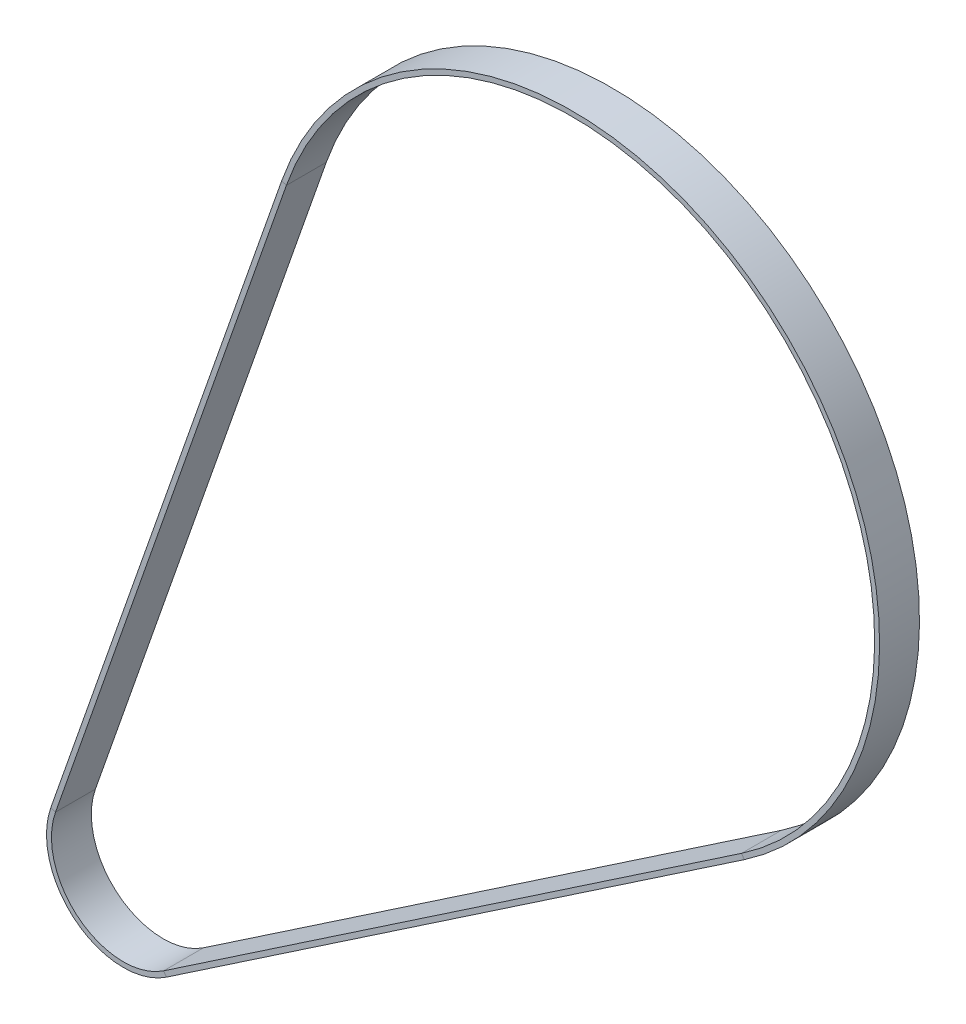
ISO-10303-21;
HEADER;
FILE_DESCRIPTION(('STEP AP214'),'2;1');
FILE_NAME('part.step','',(''),(''),'','','');
FILE_SCHEMA(('AUTOMOTIVE_DESIGN { 1 0 10303 214 1 1 1 1 }'));
ENDSEC;
DATA;
#1=APPLICATION_CONTEXT('core data for automotive mechanical design processes');
#2=APPLICATION_PROTOCOL_DEFINITION('international standard','automotive_design',2000,#1);
#3=PRODUCT_CONTEXT('',#1,'mechanical');
#4=PRODUCT('Part','Part','',(#3));
#5=PRODUCT_RELATED_PRODUCT_CATEGORY('part','',(#4));
#6=PRODUCT_DEFINITION_FORMATION('','',#4);
#7=PRODUCT_DEFINITION_CONTEXT('part definition',#1,'design');
#8=PRODUCT_DEFINITION('design','',#6,#7);
#9=PRODUCT_DEFINITION_SHAPE('','',#8);
#10=(LENGTH_UNIT() NAMED_UNIT(*) SI_UNIT(.MILLI.,.METRE.));
#11=(NAMED_UNIT(*) PLANE_ANGLE_UNIT() SI_UNIT($,.RADIAN.));
#12=(NAMED_UNIT(*) SI_UNIT($,.STERADIAN.) SOLID_ANGLE_UNIT());
#13=UNCERTAINTY_MEASURE_WITH_UNIT(LENGTH_MEASURE(1.E-05),#10,'distance_accuracy_value','');
#14=(GEOMETRIC_REPRESENTATION_CONTEXT(3) GLOBAL_UNCERTAINTY_ASSIGNED_CONTEXT((#13)) GLOBAL_UNIT_ASSIGNED_CONTEXT((#10,
#11,#12)) REPRESENTATION_CONTEXT('',''));
#15=CARTESIAN_POINT('',(0.,0.,0.));
#16=DIRECTION('',(0.,0.,1.));
#17=DIRECTION('',(1.,0.,0.));
#18=AXIS2_PLACEMENT_3D('',#15,#16,#17);
#19=CARTESIAN_POINT('',(-40.9251943674121,-65.1355885995621,2.01184288699567));
#20=DIRECTION('',(0.,0.,1.));
#21=DIRECTION('',(1.,0.,0.));
#22=AXIS2_PLACEMENT_3D('',#19,#20,#21);
#23=PLANE('',#22);
#24=DIRECTION('',(-0.560075457132163,0.828441598616462,0.));
#25=VECTOR('',#24,1.);
#26=CARTESIAN_POINT('',(-40.9251943674121,-65.1355885995621,2.01184288699567));
#27=LINE('',#26,#25);
#28=CARTESIAN_POINT('',(-40.9251943674121,-65.1355885995621,2.01184288699567));
#29=VERTEX_POINT('',#28);
#30=CARTESIAN_POINT('',(-41.2052320959782,-64.7213678002538,2.01184288699567));
#31=VERTEX_POINT('',#30);
#32=EDGE_CURVE('E263',#29,#31,#27,.T.);
#33=ORIENTED_EDGE('',*,*,#32,.T.);
#34=CARTESIAN_POINT('',(-45.2684841897135,-58.711165036947,2.01184288699567));
#35=DIRECTION('',(0.,0.,-1.));
#36=DIRECTION('',(-1.,0.,0.));
#37=AXIS2_PLACEMENT_3D('',#34,#35,#36);
#38=CIRCLE('',#37,7.25482975908508);
#39=CARTESIAN_POINT('',(-52.1144215100444,-56.3099784470695,2.01184288699567));
#40=VERTEX_POINT('',#39);
#41=EDGE_CURVE('E46',#31,#40,#38,.T.);
#42=ORIENTED_EDGE('',*,*,#41,.T.);
#43=CARTESIAN_POINT('',(-52.5862408047534,-56.1444896162068,2.01184288699567));
#44=DIRECTION('',(0.943638589418012,-0.330977661725356,0.));
#45=VECTOR('',#44,1.);
#46=LINE('',#43,#45);
#47=CARTESIAN_POINT('',(-52.5862408047533,-56.1444896162064,2.01184288699567));
#48=VERTEX_POINT('',#47);
#49=EDGE_CURVE('E215',#48,#40,#46,.T.);
#50=ORIENTED_EDGE('',*,*,#49,.F.);
#51=CARTESIAN_POINT('',(-45.2684841897135,-58.711165036947,2.01184288699567));
#52=DIRECTION('',(0.,0.,-1.));
#53=DIRECTION('',(-1.,0.,0.));
#54=AXIS2_PLACEMENT_3D('',#51,#52,#53);
#55=CIRCLE('',#54,7.75482975908509);
#56=EDGE_CURVE('E11',#29,#48,#55,.T.);
#57=ORIENTED_EDGE('',*,*,#56,.F.);
#58=EDGE_LOOP('',(#33,#42,#50,#57));
#59=FACE_BOUND('',#58,.T.);
#60=ADVANCED_FACE('F35',(#59),#23,.T.);
#61=CARTESIAN_POINT('',(-45.2684841897135,-58.711165036947,0.));
#62=DIRECTION('',(0.,0.,-1.));
#63=DIRECTION('',(-1.,0.,0.));
#64=AXIS2_PLACEMENT_3D('',#61,#62,#63);
#65=CYLINDRICAL_SURFACE('',#64,7.25482975908508);
#66=DIRECTION('',(0.,0.,-1.));
#67=VECTOR('',#66,1.);
#68=CARTESIAN_POINT('',(-41.2052320959782,-64.7213678002538,-2.01184288699567));
#69=LINE('',#68,#67);
#70=CARTESIAN_POINT('',(-41.2052320959782,-64.7213678002538,-2.01184288699567));
#71=VERTEX_POINT('',#70);
#72=EDGE_CURVE('E258',#31,#71,#69,.T.);
#73=ORIENTED_EDGE('',*,*,#72,.T.);
#74=CARTESIAN_POINT('',(-45.2684841897135,-58.711165036947,-2.01184288699567));
#75=DIRECTION('',(0.,0.,-1.));
#76=DIRECTION('',(-1.,0.,0.));
#77=AXIS2_PLACEMENT_3D('',#74,#75,#76);
#78=CIRCLE('',#77,7.25482975908508);
#79=CARTESIAN_POINT('',(-52.1144215100444,-56.3099784470695,-2.01184288699567));
#80=VERTEX_POINT('',#79);
#81=EDGE_CURVE('E214',#71,#80,#78,.T.);
#82=ORIENTED_EDGE('',*,*,#81,.T.);
#83=CARTESIAN_POINT('',(-52.1144215100444,-56.3099784470695,2.01184288699567));
#84=DIRECTION('',(0.,0.,-1.));
#85=VECTOR('',#84,1.);
#86=LINE('',#83,#85);
#87=EDGE_CURVE('E238',#40,#80,#86,.T.);
#88=ORIENTED_EDGE('',*,*,#87,.F.);
#89=ORIENTED_EDGE('',*,*,#41,.F.);
#90=EDGE_LOOP('',(#73,#82,#88,#89));
#91=FACE_BOUND('',#90,.T.);
#92=ADVANCED_FACE('F243',(#91),#65,.F.);
#93=CARTESIAN_POINT('',(-40.9251943674121,-65.1355885995621,-2.01184288699567));
#94=DIRECTION('',(0.,0.,-1.));
#95=DIRECTION('',(-1.,0.,0.));
#96=AXIS2_PLACEMENT_3D('',#93,#94,#95);
#97=PLANE('',#96);
#98=DIRECTION('',(0.560075457132163,-0.828441598616462,0.));
#99=VECTOR('',#98,1.);
#100=CARTESIAN_POINT('',(-40.9251943674121,-65.1355885995621,-2.01184288699567));
#101=LINE('',#100,#99);
#102=CARTESIAN_POINT('',(-40.9251943674121,-65.1355885995621,-2.01184288699567));
#103=VERTEX_POINT('',#102);
#104=EDGE_CURVE('E264',#71,#103,#101,.T.);
#105=ORIENTED_EDGE('',*,*,#104,.T.);
#106=CARTESIAN_POINT('',(-45.2684841897135,-58.711165036947,-2.01184288699567));
#107=DIRECTION('',(0.,0.,-1.));
#108=DIRECTION('',(-1.,0.,0.));
#109=AXIS2_PLACEMENT_3D('',#106,#107,#108);
#110=CIRCLE('',#109,7.75482975908509);
#111=CARTESIAN_POINT('',(-52.5862408047533,-56.1444896162064,-2.01184288699567));
#112=VERTEX_POINT('',#111);
#113=EDGE_CURVE('E207',#103,#112,#110,.T.);
#114=ORIENTED_EDGE('',*,*,#113,.T.);
#115=CARTESIAN_POINT('',(-52.1144215100444,-56.3099784470695,-2.01184288699567));
#116=DIRECTION('',(-0.943638589418012,0.330977661725356,0.));
#117=VECTOR('',#116,1.);
#118=LINE('',#115,#117);
#119=EDGE_CURVE('E284',#80,#112,#118,.T.);
#120=ORIENTED_EDGE('',*,*,#119,.F.);
#121=ORIENTED_EDGE('',*,*,#81,.F.);
#122=EDGE_LOOP('',(#105,#114,#120,#121));
#123=FACE_BOUND('',#122,.T.);
#124=ADVANCED_FACE('F200',(#123),#97,.T.);
#125=CARTESIAN_POINT('',(-45.2684841897135,-58.711165036947,0.));
#126=DIRECTION('',(0.,0.,-1.));
#127=DIRECTION('',(-1.,0.,0.));
#128=AXIS2_PLACEMENT_3D('',#125,#126,#127);
#129=CYLINDRICAL_SURFACE('',#128,7.75482975908509);
#130=DIRECTION('',(0.,0.,1.));
#131=VECTOR('',#130,1.);
#132=CARTESIAN_POINT('',(-40.9251943674121,-65.1355885995621,-2.01184288699567));
#133=LINE('',#132,#131);
#134=EDGE_CURVE('E117',#103,#29,#133,.T.);
#135=ORIENTED_EDGE('',*,*,#134,.T.);
#136=ORIENTED_EDGE('',*,*,#56,.T.);
#137=CARTESIAN_POINT('',(-52.5862408047534,-56.1444896162068,-2.01184288699567));
#138=DIRECTION('',(0.,0.,1.));
#139=VECTOR('',#138,1.);
#140=LINE('',#137,#139);
#141=EDGE_CURVE('E54',#112,#48,#140,.T.);
#142=ORIENTED_EDGE('',*,*,#141,.F.);
#143=ORIENTED_EDGE('',*,*,#113,.F.);
#144=EDGE_LOOP('',(#135,#136,#142,#143));
#145=FACE_BOUND('',#144,.T.);
#146=ADVANCED_FACE('F196',(#145),#129,.T.);
#147=CARTESIAN_POINT('',(17.384649330772,-25.714689867404,2.01184288699567));
#148=DIRECTION('',(0.,0.,1.));
#149=DIRECTION('',(1.,0.,0.));
#150=AXIS2_PLACEMENT_3D('',#147,#148,#149);
#151=PLANE('',#150);
#152=DIRECTION('',(-0.560075457132163,0.828441598616462,0.));
#153=VECTOR('',#152,1.);
#154=CARTESIAN_POINT('',(17.384649330772,-25.714689867404,2.01184288699567));
#155=LINE('',#154,#153);
#156=CARTESIAN_POINT('',(17.384649330772,-25.714689867404,2.01184288699567));
#157=VERTEX_POINT('',#156);
#158=CARTESIAN_POINT('',(17.1046116022059,-25.3004690680957,2.01184288699567));
#159=VERTEX_POINT('',#158);
#160=EDGE_CURVE('E114',#157,#159,#155,.T.);
#161=ORIENTED_EDGE('',*,*,#160,.T.);
#162=DIRECTION('',(-0.828441598616452,-0.560075457132178,0.));
#163=VECTOR('',#162,1.);
#164=CARTESIAN_POINT('',(17.1046116022059,-25.3004690680957,2.01184288699567));
#165=LINE('',#164,#163);
#166=EDGE_CURVE('E277',#159,#31,#165,.T.);
#167=ORIENTED_EDGE('',*,*,#166,.T.);
#168=ORIENTED_EDGE('',*,*,#32,.F.);
#169=DIRECTION('',(-0.828441598616452,-0.560075457132178,0.));
#170=VECTOR('',#169,1.);
#171=CARTESIAN_POINT('',(17.384649330772,-25.714689867404,2.01184288699567));
#172=LINE('',#171,#170);
#173=EDGE_CURVE('E279',#157,#29,#172,.T.);
#174=ORIENTED_EDGE('',*,*,#173,.F.);
#175=EDGE_LOOP('',(#161,#167,#168,#174));
#176=FACE_BOUND('',#175,.T.);
#177=ADVANCED_FACE('F192',(#176),#151,.T.);
#178=CARTESIAN_POINT('',(17.1046116022059,-25.3004690680957,-2.01184288699567));
#179=DIRECTION('',(-0.560075457132178,0.828441598616452,0.));
#180=DIRECTION('',(-0.828441598616452,-0.560075457132178,0.));
#181=AXIS2_PLACEMENT_3D('',#178,#179,#180);
#182=PLANE('',#181);
#183=DIRECTION('',(0.,0.,-1.));
#184=VECTOR('',#183,1.);
#185=CARTESIAN_POINT('',(17.1046116022059,-25.3004690680957,-2.01184288699567));
#186=LINE('',#185,#184);
#187=CARTESIAN_POINT('',(17.1046116022059,-25.3004690680957,-2.01184288699567));
#188=VERTEX_POINT('',#187);
#189=EDGE_CURVE('E275',#159,#188,#186,.T.);
#190=ORIENTED_EDGE('',*,*,#189,.T.);
#191=DIRECTION('',(-0.828441598616452,-0.560075457132178,0.));
#192=VECTOR('',#191,1.);
#193=CARTESIAN_POINT('',(17.1046116022059,-25.3004690680957,-2.01184288699567));
#194=LINE('',#193,#192);
#195=EDGE_CURVE('E269',#188,#71,#194,.T.);
#196=ORIENTED_EDGE('',*,*,#195,.T.);
#197=ORIENTED_EDGE('',*,*,#72,.F.);
#198=ORIENTED_EDGE('',*,*,#166,.F.);
#199=EDGE_LOOP('',(#190,#196,#197,#198));
#200=FACE_BOUND('',#199,.T.);
#201=ADVANCED_FACE('F188',(#200),#182,.T.);
#202=CARTESIAN_POINT('',(17.384649330772,-25.714689867404,-2.01184288699567));
#203=DIRECTION('',(0.,0.,-1.));
#204=DIRECTION('',(-1.,0.,0.));
#205=AXIS2_PLACEMENT_3D('',#202,#203,#204);
#206=PLANE('',#205);
#207=DIRECTION('',(0.560075457132163,-0.828441598616462,0.));
#208=VECTOR('',#207,1.);
#209=CARTESIAN_POINT('',(17.384649330772,-25.714689867404,-2.01184288699567));
#210=LINE('',#209,#208);
#211=CARTESIAN_POINT('',(17.384649330772,-25.714689867404,-2.01184288699567));
#212=VERTEX_POINT('',#211);
#213=EDGE_CURVE('E140',#188,#212,#210,.T.);
#214=ORIENTED_EDGE('',*,*,#213,.T.);
#215=DIRECTION('',(-0.828441598616452,-0.560075457132178,0.));
#216=VECTOR('',#215,1.);
#217=CARTESIAN_POINT('',(17.384649330772,-25.714689867404,-2.01184288699567));
#218=LINE('',#217,#216);
#219=EDGE_CURVE('E271',#212,#103,#218,.T.);
#220=ORIENTED_EDGE('',*,*,#219,.T.);
#221=ORIENTED_EDGE('',*,*,#104,.F.);
#222=ORIENTED_EDGE('',*,*,#195,.F.);
#223=EDGE_LOOP('',(#214,#220,#221,#222));
#224=FACE_BOUND('',#223,.T.);
#225=ADVANCED_FACE('F184',(#224),#206,.T.);
#226=CARTESIAN_POINT('',(17.384649330772,-25.714689867404,-2.01184288699567));
#227=DIRECTION('',(0.560075457132178,-0.828441598616452,0.));
#228=DIRECTION('',(0.828441598616452,0.560075457132178,0.));
#229=AXIS2_PLACEMENT_3D('',#226,#227,#228);
#230=PLANE('',#229);
#231=DIRECTION('',(0.,0.,1.));
#232=VECTOR('',#231,1.);
#233=CARTESIAN_POINT('',(17.384649330772,-25.714689867404,-2.01184288699567));
#234=LINE('',#233,#232);
#235=EDGE_CURVE('E137',#212,#157,#234,.T.);
#236=ORIENTED_EDGE('',*,*,#235,.T.);
#237=ORIENTED_EDGE('',*,*,#173,.T.);
#238=ORIENTED_EDGE('',*,*,#134,.F.);
#239=ORIENTED_EDGE('',*,*,#219,.F.);
#240=EDGE_LOOP('',(#236,#237,#238,#239));
#241=FACE_BOUND('',#240,.T.);
#242=ADVANCED_FACE('F181',(#241),#230,.T.);
#243=CARTESIAN_POINT('',(-29.2903853636138,10.2734917459457,2.01184288699567));
#244=DIRECTION('',(0.,0.,1.));
#245=DIRECTION('',(1.,0.,0.));
#246=AXIS2_PLACEMENT_3D('',#243,#244,#245);
#247=PLANE('',#246);
#248=DIRECTION('',(0.943638589418013,-0.330977661725352,0.));
#249=VECTOR('',#248,1.);
#250=CARTESIAN_POINT('',(-29.2903853636138,10.2734917459457,2.01184288699567));
#251=LINE('',#250,#249);
#252=CARTESIAN_POINT('',(-29.2903853636138,10.2734917459457,2.01184288699567));
#253=VERTEX_POINT('',#252);
#254=CARTESIAN_POINT('',(-28.8185660689048,10.1080029150831,2.01184288699567));
#255=VERTEX_POINT('',#254);
#256=EDGE_CURVE('E111',#253,#255,#251,.T.);
#257=ORIENTED_EDGE('',*,*,#256,.T.);
#258=CARTESIAN_POINT('',(-5.77315972805081E-11,9.30144850030956E-10,2.01184288699567));
#259=DIRECTION('',(0.,0.,-1.));
#260=DIRECTION('',(-1.,0.,0.));
#261=AXIS2_PLACEMENT_3D('',#258,#259,#260);
#262=CIRCLE('',#261,30.5398342034961);
#263=EDGE_CURVE('E118',#255,#159,#262,.T.);
#264=ORIENTED_EDGE('',*,*,#263,.T.);
#265=ORIENTED_EDGE('',*,*,#160,.F.);
#266=CARTESIAN_POINT('',(-5.77315972805081E-11,9.30144850030956E-10,2.01184288699567));
#267=DIRECTION('',(0.,0.,-1.));
#268=DIRECTION('',(-1.,0.,0.));
#269=AXIS2_PLACEMENT_3D('',#266,#267,#268);
#270=CIRCLE('',#269,31.0398342034961);
#271=EDGE_CURVE('E106',#253,#157,#270,.T.);
#272=ORIENTED_EDGE('',*,*,#271,.F.);
#273=EDGE_LOOP('',(#257,#264,#265,#272));
#274=FACE_BOUND('',#273,.T.);
#275=ADVANCED_FACE('F108',(#274),#247,.T.);
#276=CARTESIAN_POINT('',(-5.77315972805081E-11,9.30144850030956E-10,0.));
#277=DIRECTION('',(0.,0.,-1.));
#278=DIRECTION('',(-1.,0.,0.));
#279=AXIS2_PLACEMENT_3D('',#276,#277,#278);
#280=CYLINDRICAL_SURFACE('',#279,30.5398342034961);
#281=DIRECTION('',(0.,0.,-1.));
#282=VECTOR('',#281,1.);
#283=CARTESIAN_POINT('',(-28.8185660689048,10.1080029150831,-2.01184288699567));
#284=LINE('',#283,#282);
#285=CARTESIAN_POINT('',(-28.8185660689048,10.1080029150831,-2.01184288699567));
#286=VERTEX_POINT('',#285);
#287=EDGE_CURVE('E134',#255,#286,#284,.T.);
#288=ORIENTED_EDGE('',*,*,#287,.T.);
#289=CARTESIAN_POINT('',(-5.77315972805081E-11,9.30144850030956E-10,-2.01184288699567));
#290=DIRECTION('',(0.,0.,-1.));
#291=DIRECTION('',(-1.,0.,0.));
#292=AXIS2_PLACEMENT_3D('',#289,#290,#291);
#293=CIRCLE('',#292,30.5398342034961);
#294=EDGE_CURVE('E307',#286,#188,#293,.T.);
#295=ORIENTED_EDGE('',*,*,#294,.T.);
#296=ORIENTED_EDGE('',*,*,#189,.F.);
#297=ORIENTED_EDGE('',*,*,#263,.F.);
#298=EDGE_LOOP('',(#288,#295,#296,#297));
#299=FACE_BOUND('',#298,.T.);
#300=ADVANCED_FACE('F174',(#299),#280,.F.);
#301=CARTESIAN_POINT('',(-29.2903853636138,10.2734917459457,-2.01184288699567));
#302=DIRECTION('',(0.,0.,-1.));
#303=DIRECTION('',(-1.,0.,0.));
#304=AXIS2_PLACEMENT_3D('',#301,#302,#303);
#305=PLANE('',#304);
#306=DIRECTION('',(-0.943638589418013,0.330977661725352,0.));
#307=VECTOR('',#306,1.);
#308=CARTESIAN_POINT('',(-29.2903853636138,10.2734917459457,-2.01184288699567));
#309=LINE('',#308,#307);
#310=CARTESIAN_POINT('',(-29.2903853636138,10.2734917459457,-2.01184288699567));
#311=VERTEX_POINT('',#310);
#312=EDGE_CURVE('E299',#286,#311,#309,.T.);
#313=ORIENTED_EDGE('',*,*,#312,.T.);
#314=CARTESIAN_POINT('',(-5.77315972805081E-11,9.30144850030956E-10,-2.01184288699567));
#315=DIRECTION('',(0.,0.,-1.));
#316=DIRECTION('',(-1.,0.,0.));
#317=AXIS2_PLACEMENT_3D('',#314,#315,#316);
#318=CIRCLE('',#317,31.0398342034961);
#319=EDGE_CURVE('E124',#311,#212,#318,.T.);
#320=ORIENTED_EDGE('',*,*,#319,.T.);
#321=ORIENTED_EDGE('',*,*,#213,.F.);
#322=ORIENTED_EDGE('',*,*,#294,.F.);
#323=EDGE_LOOP('',(#313,#320,#321,#322));
#324=FACE_BOUND('',#323,.T.);
#325=ADVANCED_FACE('F171',(#324),#305,.T.);
#326=CARTESIAN_POINT('',(-5.77315972805081E-11,9.30144850030956E-10,0.));
#327=DIRECTION('',(0.,0.,-1.));
#328=DIRECTION('',(-1.,0.,0.));
#329=AXIS2_PLACEMENT_3D('',#326,#327,#328);
#330=CYLINDRICAL_SURFACE('',#329,31.0398342034961);
#331=DIRECTION('',(0.,0.,1.));
#332=VECTOR('',#331,1.);
#333=CARTESIAN_POINT('',(-29.2903853636138,10.2734917459457,-2.01184288699567));
#334=LINE('',#333,#332);
#335=EDGE_CURVE('E121',#311,#253,#334,.T.);
#336=ORIENTED_EDGE('',*,*,#335,.T.);
#337=ORIENTED_EDGE('',*,*,#271,.T.);
#338=ORIENTED_EDGE('',*,*,#235,.F.);
#339=ORIENTED_EDGE('',*,*,#319,.F.);
#340=EDGE_LOOP('',(#336,#337,#338,#339));
#341=FACE_BOUND('',#340,.T.);
#342=ADVANCED_FACE('F122',(#341),#330,.T.);
#343=CARTESIAN_POINT('',(-29.2903853636138,10.2734917459457,-2.01184288699567));
#344=DIRECTION('',(0.943638589418015,-0.330977661725347,0.));
#345=DIRECTION('',(0.330977661725347,0.943638589418015,0.));
#346=AXIS2_PLACEMENT_3D('',#343,#344,#345);
#347=PLANE('',#346);
#348=ORIENTED_EDGE('',*,*,#141,.T.);
#349=DIRECTION('',(-0.330977661725347,-0.943638589418015,0.));
#350=VECTOR('',#349,1.);
#351=CARTESIAN_POINT('',(-29.2903853636138,10.2734917459457,2.01184288699567));
#352=LINE('',#351,#350);
#353=EDGE_CURVE('E129',#253,#48,#352,.T.);
#354=ORIENTED_EDGE('',*,*,#353,.F.);
#355=ORIENTED_EDGE('',*,*,#335,.F.);
#356=DIRECTION('',(-0.330977661725347,-0.943638589418015,0.));
#357=VECTOR('',#356,1.);
#358=CARTESIAN_POINT('',(-29.2903853636138,10.2734917459457,-2.01184288699567));
#359=LINE('',#358,#357);
#360=EDGE_CURVE('E156',#311,#112,#359,.T.);
#361=ORIENTED_EDGE('',*,*,#360,.T.);
#362=EDGE_LOOP('',(#348,#354,#355,#361));
#363=FACE_BOUND('',#362,.T.);
#364=ADVANCED_FACE('F136',(#363),#347,.F.);
#365=CARTESIAN_POINT('',(-29.2903853636138,10.2734917459457,2.01184288699567));
#366=DIRECTION('',(0.,0.,-1.));
#367=DIRECTION('',(-1.,0.,0.));
#368=AXIS2_PLACEMENT_3D('',#365,#366,#367);
#369=PLANE('',#368);
#370=ORIENTED_EDGE('',*,*,#49,.T.);
#371=DIRECTION('',(-0.330977661725347,-0.943638589418015,0.));
#372=VECTOR('',#371,1.);
#373=CARTESIAN_POINT('',(-28.8185660689048,10.1080029150831,2.01184288699567));
#374=LINE('',#373,#372);
#375=EDGE_CURVE('E132',#255,#40,#374,.T.);
#376=ORIENTED_EDGE('',*,*,#375,.F.);
#377=ORIENTED_EDGE('',*,*,#256,.F.);
#378=ORIENTED_EDGE('',*,*,#353,.T.);
#379=EDGE_LOOP('',(#370,#376,#377,#378));
#380=FACE_BOUND('',#379,.T.);
#381=ADVANCED_FACE('F128',(#380),#369,.F.);
#382=CARTESIAN_POINT('',(-28.8185660689048,10.1080029150831,-2.01184288699567));
#383=DIRECTION('',(-0.943638589418015,0.330977661725347,0.));
#384=DIRECTION('',(-0.330977661725347,-0.943638589418015,0.));
#385=AXIS2_PLACEMENT_3D('',#382,#383,#384);
#386=PLANE('',#385);
#387=ORIENTED_EDGE('',*,*,#87,.T.);
#388=DIRECTION('',(-0.330977661725347,-0.943638589418015,0.));
#389=VECTOR('',#388,1.);
#390=CARTESIAN_POINT('',(-28.8185660689048,10.1080029150831,-2.01184288699567));
#391=LINE('',#390,#389);
#392=EDGE_CURVE('E142',#286,#80,#391,.T.);
#393=ORIENTED_EDGE('',*,*,#392,.F.);
#394=ORIENTED_EDGE('',*,*,#287,.F.);
#395=ORIENTED_EDGE('',*,*,#375,.T.);
#396=EDGE_LOOP('',(#387,#393,#394,#395));
#397=FACE_BOUND('',#396,.T.);
#398=ADVANCED_FACE('F295',(#397),#386,.F.);
#399=CARTESIAN_POINT('',(-29.2903853636138,10.2734917459457,-2.01184288699567));
#400=DIRECTION('',(0.,0.,1.));
#401=DIRECTION('',(1.,0.,0.));
#402=AXIS2_PLACEMENT_3D('',#399,#400,#401);
#403=PLANE('',#402);
#404=ORIENTED_EDGE('',*,*,#119,.T.);
#405=ORIENTED_EDGE('',*,*,#360,.F.);
#406=ORIENTED_EDGE('',*,*,#312,.F.);
#407=ORIENTED_EDGE('',*,*,#392,.T.);
#408=EDGE_LOOP('',(#404,#405,#406,#407));
#409=FACE_BOUND('',#408,.T.);
#410=ADVANCED_FACE('F313',(#409),#403,.F.);
#411=CLOSED_SHELL('',(#60,#92,#124,#146,#177,#201,#225,#242,#275,#300,#325,#342,#364,#381,#398,#410));
#412=MANIFOLD_SOLID_BREP('B2',#411);
#413=ADVANCED_BREP_SHAPE_REPRESENTATION('',(#18,#412),#14);
#414=SHAPE_DEFINITION_REPRESENTATION(#9,#413);
ENDSEC;
END-ISO-10303-21;
